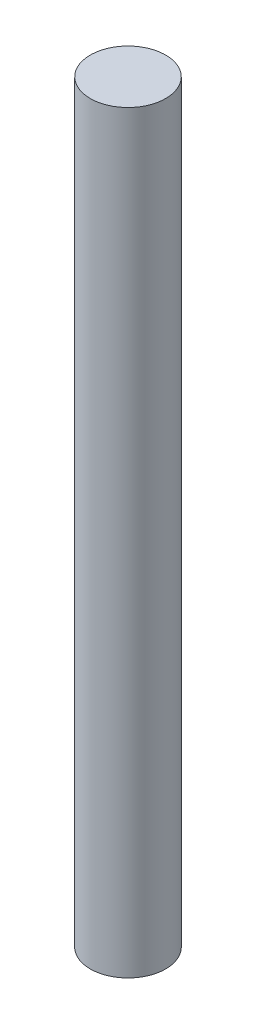
ISO-10303-21;
HEADER;
FILE_DESCRIPTION(('STEP AP214'),'2;1');
FILE_NAME('part.step','',(''),(''),'','','');
FILE_SCHEMA(('AUTOMOTIVE_DESIGN { 1 0 10303 214 1 1 1 1 }'));
ENDSEC;
DATA;
#1=APPLICATION_CONTEXT('core data for automotive mechanical design processes');
#2=APPLICATION_PROTOCOL_DEFINITION('international standard','automotive_design',2000,#1);
#3=PRODUCT_CONTEXT('',#1,'mechanical');
#4=PRODUCT('Part','Part','',(#3));
#5=PRODUCT_RELATED_PRODUCT_CATEGORY('part','',(#4));
#6=PRODUCT_DEFINITION_FORMATION('','',#4);
#7=PRODUCT_DEFINITION_CONTEXT('part definition',#1,'design');
#8=PRODUCT_DEFINITION('design','',#6,#7);
#9=PRODUCT_DEFINITION_SHAPE('','',#8);
#10=(LENGTH_UNIT() NAMED_UNIT(*) SI_UNIT(.MILLI.,.METRE.));
#11=(NAMED_UNIT(*) PLANE_ANGLE_UNIT() SI_UNIT($,.RADIAN.));
#12=(NAMED_UNIT(*) SI_UNIT($,.STERADIAN.) SOLID_ANGLE_UNIT());
#13=UNCERTAINTY_MEASURE_WITH_UNIT(LENGTH_MEASURE(1.E-05),#10,'distance_accuracy_value','');
#14=(GEOMETRIC_REPRESENTATION_CONTEXT(3) GLOBAL_UNCERTAINTY_ASSIGNED_CONTEXT((#13)) GLOBAL_UNIT_ASSIGNED_CONTEXT((#10,
#11,#12)) REPRESENTATION_CONTEXT('',''));
#15=CARTESIAN_POINT('',(0.,0.,0.));
#16=DIRECTION('',(0.,0.,1.));
#17=DIRECTION('',(1.,0.,0.));
#18=AXIS2_PLACEMENT_3D('',#15,#16,#17);
#19=CARTESIAN_POINT('',(0.,30.,0.));
#20=DIRECTION('',(0.,-1.,0.));
#21=DIRECTION('',(0.,0.,-1.));
#22=AXIS2_PLACEMENT_3D('',#19,#20,#21);
#23=CYLINDRICAL_SURFACE('',#22,1.5);
#24=CARTESIAN_POINT('',(0.,30.,0.));
#25=DIRECTION('',(0.,1.,0.));
#26=DIRECTION('',(0.,0.,1.));
#27=AXIS2_PLACEMENT_3D('',#24,#25,#26);
#28=CIRCLE('',#27,1.5);
#29=CARTESIAN_POINT('',(0.,30.,1.5));
#30=VERTEX_POINT('',#29);
#31=EDGE_CURVE('E12',#30,#30,#28,.T.);
#32=ORIENTED_EDGE('',*,*,#31,.F.);
#33=EDGE_LOOP('',(#32));
#34=FACE_BOUND('',#33,.T.);
#35=CARTESIAN_POINT('',(0.,0.,0.));
#36=DIRECTION('',(0.,1.,0.));
#37=DIRECTION('',(0.,0.,1.));
#38=AXIS2_PLACEMENT_3D('',#35,#36,#37);
#39=CIRCLE('',#38,1.5);
#40=CARTESIAN_POINT('',(0.,0.,1.5));
#41=VERTEX_POINT('',#40);
#42=EDGE_CURVE('E55',#41,#41,#39,.T.);
#43=ORIENTED_EDGE('',*,*,#42,.T.);
#44=EDGE_LOOP('',(#43));
#45=FACE_BOUND('',#44,.T.);
#46=ADVANCED_FACE('F52',(#34,#45),#23,.T.);
#47=CARTESIAN_POINT('',(0.,30.,0.));
#48=DIRECTION('',(0.,1.,0.));
#49=DIRECTION('',(0.,0.,1.));
#50=AXIS2_PLACEMENT_3D('',#47,#48,#49);
#51=PLANE('',#50);
#52=ORIENTED_EDGE('',*,*,#31,.T.);
#53=EDGE_LOOP('',(#52));
#54=FACE_BOUND('',#53,.T.);
#55=ADVANCED_FACE('F71',(#54),#51,.T.);
#56=CARTESIAN_POINT('',(0.,0.,0.));
#57=DIRECTION('',(0.,1.,0.));
#58=DIRECTION('',(0.,0.,1.));
#59=AXIS2_PLACEMENT_3D('',#56,#57,#58);
#60=PLANE('',#59);
#61=ORIENTED_EDGE('',*,*,#42,.F.);
#62=EDGE_LOOP('',(#61));
#63=FACE_BOUND('',#62,.T.);
#64=ADVANCED_FACE('F69',(#63),#60,.F.);
#65=CLOSED_SHELL('',(#46,#55,#64));
#66=MANIFOLD_SOLID_BREP('B2',#65);
#67=ADVANCED_BREP_SHAPE_REPRESENTATION('',(#18,#66),#14);
#68=SHAPE_DEFINITION_REPRESENTATION(#9,#67);
ENDSEC;
END-ISO-10303-21;
